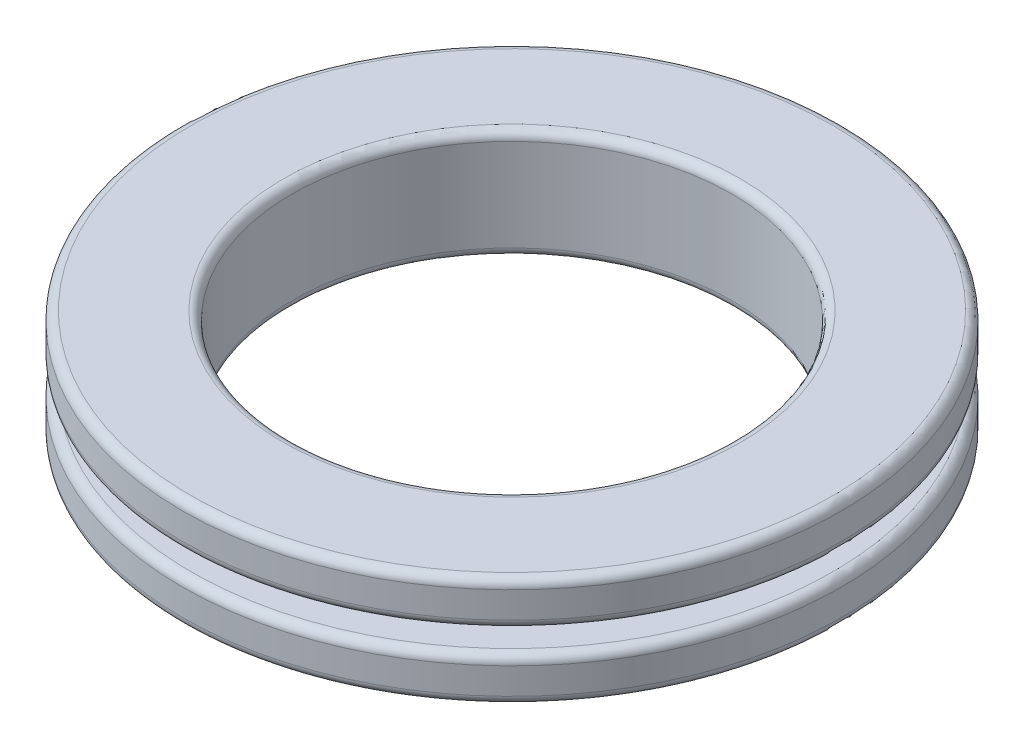
ISO-10303-21;
HEADER;
FILE_DESCRIPTION(('STEP AP214'),'2;1');
FILE_NAME('part.step','',(''),(''),'','','');
FILE_SCHEMA(('AUTOMOTIVE_DESIGN { 1 0 10303 214 1 1 1 1 }'));
ENDSEC;
DATA;
#1=APPLICATION_CONTEXT('core data for automotive mechanical design processes');
#2=APPLICATION_PROTOCOL_DEFINITION('international standard','automotive_design',2000,#1);
#3=PRODUCT_CONTEXT('',#1,'mechanical');
#4=PRODUCT('Part','Part','',(#3));
#5=PRODUCT_RELATED_PRODUCT_CATEGORY('part','',(#4));
#6=PRODUCT_DEFINITION_FORMATION('','',#4);
#7=PRODUCT_DEFINITION_CONTEXT('part definition',#1,'design');
#8=PRODUCT_DEFINITION('design','',#6,#7);
#9=PRODUCT_DEFINITION_SHAPE('','',#8);
#10=(LENGTH_UNIT() NAMED_UNIT(*) SI_UNIT(.MILLI.,.METRE.));
#11=(NAMED_UNIT(*) PLANE_ANGLE_UNIT() SI_UNIT($,.RADIAN.));
#12=(NAMED_UNIT(*) SI_UNIT($,.STERADIAN.) SOLID_ANGLE_UNIT());
#13=UNCERTAINTY_MEASURE_WITH_UNIT(LENGTH_MEASURE(1.E-05),#10,'distance_accuracy_value','');
#14=(GEOMETRIC_REPRESENTATION_CONTEXT(3) GLOBAL_UNCERTAINTY_ASSIGNED_CONTEXT((#13)) GLOBAL_UNIT_ASSIGNED_CONTEXT((#10,
#11,#12)) REPRESENTATION_CONTEXT('',''));
#15=CARTESIAN_POINT('',(0.,0.,0.));
#16=DIRECTION('',(0.,0.,1.));
#17=DIRECTION('',(1.,0.,0.));
#18=AXIS2_PLACEMENT_3D('',#15,#16,#17);
#19=CARTESIAN_POINT('',(0.,9.2,0.));
#20=DIRECTION('',(0.,-1.,0.));
#21=DIRECTION('',(0.,0.,-1.));
#22=AXIS2_PLACEMENT_3D('',#19,#20,#21);
#23=TOROIDAL_SURFACE('',#22,20.8,0.799999999999999);
#24=CARTESIAN_POINT('',(0.,9.19999999999999,0.));
#25=DIRECTION('',(0.,-1.,0.));
#26=DIRECTION('',(0.,0.,-1.));
#27=AXIS2_PLACEMENT_3D('',#24,#25,#26);
#28=CIRCLE('',#27,20.);
#29=CARTESIAN_POINT('',(0.,9.19999999999999,-20.));
#30=VERTEX_POINT('',#29);
#31=EDGE_CURVE('E83',#30,#30,#28,.T.);
#32=ORIENTED_EDGE('',*,*,#31,.T.);
#33=EDGE_LOOP('',(#32));
#34=FACE_BOUND('',#33,.T.);
#35=CARTESIAN_POINT('',(0.,10.,0.));
#36=DIRECTION('',(0.,-1.,0.));
#37=DIRECTION('',(0.,0.,-1.));
#38=AXIS2_PLACEMENT_3D('',#35,#36,#37);
#39=CIRCLE('',#38,20.8);
#40=CARTESIAN_POINT('',(0.,10.,-20.8));
#41=VERTEX_POINT('',#40);
#42=EDGE_CURVE('E10',#41,#41,#39,.T.);
#43=ORIENTED_EDGE('',*,*,#42,.F.);
#44=EDGE_LOOP('',(#43));
#45=FACE_BOUND('',#44,.T.);
#46=ADVANCED_FACE('F31',(#34,#45),#23,.T.);
#47=CARTESIAN_POINT('',(29.2,10.,0.));
#48=DIRECTION('',(0.,1.,0.));
#49=DIRECTION('',(0.,0.,1.));
#50=AXIS2_PLACEMENT_3D('',#47,#48,#49);
#51=PLANE('',#50);
#52=ORIENTED_EDGE('',*,*,#42,.T.);
#53=EDGE_LOOP('',(#52));
#54=FACE_BOUND('',#53,.T.);
#55=CARTESIAN_POINT('',(0.,10.,0.));
#56=DIRECTION('',(0.,-1.,0.));
#57=DIRECTION('',(0.,0.,-1.));
#58=AXIS2_PLACEMENT_3D('',#55,#56,#57);
#59=CIRCLE('',#58,29.2);
#60=CARTESIAN_POINT('',(0.,10.,-29.2));
#61=VERTEX_POINT('',#60);
#62=EDGE_CURVE('E37',#61,#61,#59,.T.);
#63=ORIENTED_EDGE('',*,*,#62,.F.);
#64=EDGE_LOOP('',(#63));
#65=FACE_BOUND('',#64,.T.);
#66=ADVANCED_FACE('F101',(#54,#65),#51,.T.);
#67=CARTESIAN_POINT('',(0.,9.2,0.));
#68=DIRECTION('',(0.,-1.,0.));
#69=DIRECTION('',(0.,0.,-1.));
#70=AXIS2_PLACEMENT_3D('',#67,#68,#69);
#71=TOROIDAL_SURFACE('',#70,29.2,0.799999999999999);
#72=ORIENTED_EDGE('',*,*,#62,.T.);
#73=EDGE_LOOP('',(#72));
#74=FACE_BOUND('',#73,.T.);
#75=CARTESIAN_POINT('',(0.,9.2,0.));
#76=DIRECTION('',(0.,-1.,0.));
#77=DIRECTION('',(0.,0.,-1.));
#78=AXIS2_PLACEMENT_3D('',#75,#76,#77);
#79=CIRCLE('',#78,30.);
#80=CARTESIAN_POINT('',(0.,9.2,-30.));
#81=VERTEX_POINT('',#80);
#82=EDGE_CURVE('E41',#81,#81,#79,.T.);
#83=ORIENTED_EDGE('',*,*,#82,.F.);
#84=EDGE_LOOP('',(#83));
#85=FACE_BOUND('',#84,.T.);
#86=ADVANCED_FACE('F105',(#74,#85),#71,.T.);
#87=CARTESIAN_POINT('',(0.,0.,0.));
#88=DIRECTION('',(0.,-1.,0.));
#89=DIRECTION('',(0.,0.,-1.));
#90=AXIS2_PLACEMENT_3D('',#87,#88,#89);
#91=CYLINDRICAL_SURFACE('',#90,30.);
#92=ORIENTED_EDGE('',*,*,#82,.T.);
#93=EDGE_LOOP('',(#92));
#94=FACE_BOUND('',#93,.T.);
#95=CARTESIAN_POINT('',(0.,6.80000000000001,0.));
#96=DIRECTION('',(0.,-1.,0.));
#97=DIRECTION('',(0.,0.,-1.));
#98=AXIS2_PLACEMENT_3D('',#95,#96,#97);
#99=CIRCLE('',#98,30.);
#100=CARTESIAN_POINT('',(0.,6.80000000000001,-30.));
#101=VERTEX_POINT('',#100);
#102=EDGE_CURVE('E45',#101,#101,#99,.T.);
#103=ORIENTED_EDGE('',*,*,#102,.F.);
#104=EDGE_LOOP('',(#103));
#105=FACE_BOUND('',#104,.T.);
#106=ADVANCED_FACE('F109',(#94,#105),#91,.T.);
#107=CARTESIAN_POINT('',(0.,6.8,0.));
#108=DIRECTION('',(0.,-1.,0.));
#109=DIRECTION('',(0.,0.,-1.));
#110=AXIS2_PLACEMENT_3D('',#107,#108,#109);
#111=TOROIDAL_SURFACE('',#110,29.2,0.799999999999999);
#112=ORIENTED_EDGE('',*,*,#102,.T.);
#113=EDGE_LOOP('',(#112));
#114=FACE_BOUND('',#113,.T.);
#115=CARTESIAN_POINT('',(0.,6.,0.));
#116=DIRECTION('',(0.,-1.,0.));
#117=DIRECTION('',(0.,0.,-1.));
#118=AXIS2_PLACEMENT_3D('',#115,#116,#117);
#119=CIRCLE('',#118,29.2);
#120=CARTESIAN_POINT('',(0.,6.,-29.2));
#121=VERTEX_POINT('',#120);
#122=EDGE_CURVE('E50',#121,#121,#119,.T.);
#123=ORIENTED_EDGE('',*,*,#122,.F.);
#124=EDGE_LOOP('',(#123));
#125=FACE_BOUND('',#124,.T.);
#126=ADVANCED_FACE('F115',(#114,#125),#111,.T.);
#127=CARTESIAN_POINT('',(25.8,6.,0.));
#128=DIRECTION('',(0.,-1.,0.));
#129=DIRECTION('',(0.,0.,-1.));
#130=AXIS2_PLACEMENT_3D('',#127,#128,#129);
#131=PLANE('',#130);
#132=ORIENTED_EDGE('',*,*,#122,.T.);
#133=EDGE_LOOP('',(#132));
#134=FACE_BOUND('',#133,.T.);
#135=CARTESIAN_POINT('',(0.,6.,0.));
#136=DIRECTION('',(0.,-1.,0.));
#137=DIRECTION('',(0.,0.,-1.));
#138=AXIS2_PLACEMENT_3D('',#135,#136,#137);
#139=CIRCLE('',#138,25.8);
#140=CARTESIAN_POINT('',(0.,6.,-25.8));
#141=VERTEX_POINT('',#140);
#142=EDGE_CURVE('E53',#141,#141,#139,.T.);
#143=ORIENTED_EDGE('',*,*,#142,.F.);
#144=EDGE_LOOP('',(#143));
#145=FACE_BOUND('',#144,.T.);
#146=ADVANCED_FACE('F119',(#134,#145),#131,.T.);
#147=CARTESIAN_POINT('',(0.,5.2,0.));
#148=DIRECTION('',(0.,-1.,0.));
#149=DIRECTION('',(0.,0.,-1.));
#150=AXIS2_PLACEMENT_3D('',#147,#148,#149);
#151=TOROIDAL_SURFACE('',#150,25.8,0.799999999999999);
#152=ORIENTED_EDGE('',*,*,#142,.T.);
#153=EDGE_LOOP('',(#152));
#154=FACE_BOUND('',#153,.T.);
#155=CARTESIAN_POINT('',(0.,5.19999999999999,0.));
#156=DIRECTION('',(0.,-1.,0.));
#157=DIRECTION('',(0.,0.,-1.));
#158=AXIS2_PLACEMENT_3D('',#155,#156,#157);
#159=CIRCLE('',#158,25.);
#160=CARTESIAN_POINT('',(0.,5.19999999999999,-25.));
#161=VERTEX_POINT('',#160);
#162=EDGE_CURVE('E56',#161,#161,#159,.T.);
#163=ORIENTED_EDGE('',*,*,#162,.F.);
#164=EDGE_LOOP('',(#163));
#165=FACE_BOUND('',#164,.T.);
#166=ADVANCED_FACE('F123',(#154,#165),#151,.F.);
#167=CARTESIAN_POINT('',(0.,0.,0.));
#168=DIRECTION('',(0.,-1.,0.));
#169=DIRECTION('',(0.,0.,-1.));
#170=AXIS2_PLACEMENT_3D('',#167,#168,#169);
#171=CYLINDRICAL_SURFACE('',#170,25.);
#172=ORIENTED_EDGE('',*,*,#162,.T.);
#173=EDGE_LOOP('',(#172));
#174=FACE_BOUND('',#173,.T.);
#175=CARTESIAN_POINT('',(0.,4.80000000000001,0.));
#176=DIRECTION('',(0.,-1.,0.));
#177=DIRECTION('',(0.,0.,-1.));
#178=AXIS2_PLACEMENT_3D('',#175,#176,#177);
#179=CIRCLE('',#178,25.);
#180=CARTESIAN_POINT('',(0.,4.80000000000001,-25.));
#181=VERTEX_POINT('',#180);
#182=EDGE_CURVE('E59',#181,#181,#179,.T.);
#183=ORIENTED_EDGE('',*,*,#182,.F.);
#184=EDGE_LOOP('',(#183));
#185=FACE_BOUND('',#184,.T.);
#186=ADVANCED_FACE('F127',(#174,#185),#171,.T.);
#187=CARTESIAN_POINT('',(0.,4.8,0.));
#188=DIRECTION('',(0.,-1.,0.));
#189=DIRECTION('',(0.,0.,-1.));
#190=AXIS2_PLACEMENT_3D('',#187,#188,#189);
#191=TOROIDAL_SURFACE('',#190,25.8,0.799999999999999);
#192=ORIENTED_EDGE('',*,*,#182,.T.);
#193=EDGE_LOOP('',(#192));
#194=FACE_BOUND('',#193,.T.);
#195=CARTESIAN_POINT('',(0.,4.,0.));
#196=DIRECTION('',(0.,-1.,0.));
#197=DIRECTION('',(0.,0.,-1.));
#198=AXIS2_PLACEMENT_3D('',#195,#196,#197);
#199=CIRCLE('',#198,25.8);
#200=CARTESIAN_POINT('',(0.,4.,-25.8));
#201=VERTEX_POINT('',#200);
#202=EDGE_CURVE('E62',#201,#201,#199,.T.);
#203=ORIENTED_EDGE('',*,*,#202,.F.);
#204=EDGE_LOOP('',(#203));
#205=FACE_BOUND('',#204,.T.);
#206=ADVANCED_FACE('F131',(#194,#205),#191,.F.);
#207=CARTESIAN_POINT('',(29.2,4.,0.));
#208=DIRECTION('',(0.,1.,0.));
#209=DIRECTION('',(0.,0.,1.));
#210=AXIS2_PLACEMENT_3D('',#207,#208,#209);
#211=PLANE('',#210);
#212=ORIENTED_EDGE('',*,*,#202,.T.);
#213=EDGE_LOOP('',(#212));
#214=FACE_BOUND('',#213,.T.);
#215=CARTESIAN_POINT('',(0.,4.,0.));
#216=DIRECTION('',(0.,-1.,0.));
#217=DIRECTION('',(0.,0.,-1.));
#218=AXIS2_PLACEMENT_3D('',#215,#216,#217);
#219=CIRCLE('',#218,29.2);
#220=CARTESIAN_POINT('',(0.,4.,-29.2));
#221=VERTEX_POINT('',#220);
#222=EDGE_CURVE('E65',#221,#221,#219,.T.);
#223=ORIENTED_EDGE('',*,*,#222,.F.);
#224=EDGE_LOOP('',(#223));
#225=FACE_BOUND('',#224,.T.);
#226=ADVANCED_FACE('F135',(#214,#225),#211,.T.);
#227=CARTESIAN_POINT('',(0.,3.2,0.));
#228=DIRECTION('',(0.,-1.,0.));
#229=DIRECTION('',(0.,0.,-1.));
#230=AXIS2_PLACEMENT_3D('',#227,#228,#229);
#231=TOROIDAL_SURFACE('',#230,29.2,0.799999999999999);
#232=ORIENTED_EDGE('',*,*,#222,.T.);
#233=EDGE_LOOP('',(#232));
#234=FACE_BOUND('',#233,.T.);
#235=CARTESIAN_POINT('',(0.,3.19999999999999,0.));
#236=DIRECTION('',(0.,-1.,0.));
#237=DIRECTION('',(0.,0.,-1.));
#238=AXIS2_PLACEMENT_3D('',#235,#236,#237);
#239=CIRCLE('',#238,30.);
#240=CARTESIAN_POINT('',(0.,3.19999999999999,-30.));
#241=VERTEX_POINT('',#240);
#242=EDGE_CURVE('E68',#241,#241,#239,.T.);
#243=ORIENTED_EDGE('',*,*,#242,.F.);
#244=EDGE_LOOP('',(#243));
#245=FACE_BOUND('',#244,.T.);
#246=ADVANCED_FACE('F139',(#234,#245),#231,.T.);
#247=CARTESIAN_POINT('',(0.,0.,0.));
#248=DIRECTION('',(0.,-1.,0.));
#249=DIRECTION('',(0.,0.,-1.));
#250=AXIS2_PLACEMENT_3D('',#247,#248,#249);
#251=CYLINDRICAL_SURFACE('',#250,30.);
#252=ORIENTED_EDGE('',*,*,#242,.T.);
#253=EDGE_LOOP('',(#252));
#254=FACE_BOUND('',#253,.T.);
#255=CARTESIAN_POINT('',(0.,0.800000000000006,0.));
#256=DIRECTION('',(0.,-1.,0.));
#257=DIRECTION('',(0.,0.,-1.));
#258=AXIS2_PLACEMENT_3D('',#255,#256,#257);
#259=CIRCLE('',#258,30.);
#260=CARTESIAN_POINT('',(0.,0.800000000000006,-30.));
#261=VERTEX_POINT('',#260);
#262=EDGE_CURVE('E71',#261,#261,#259,.T.);
#263=ORIENTED_EDGE('',*,*,#262,.F.);
#264=EDGE_LOOP('',(#263));
#265=FACE_BOUND('',#264,.T.);
#266=ADVANCED_FACE('F143',(#254,#265),#251,.T.);
#267=CARTESIAN_POINT('',(0.,0.8,0.));
#268=DIRECTION('',(0.,-1.,0.));
#269=DIRECTION('',(0.,0.,-1.));
#270=AXIS2_PLACEMENT_3D('',#267,#268,#269);
#271=TOROIDAL_SURFACE('',#270,29.2,0.799999999999999);
#272=ORIENTED_EDGE('',*,*,#262,.T.);
#273=EDGE_LOOP('',(#272));
#274=FACE_BOUND('',#273,.T.);
#275=CARTESIAN_POINT('',(0.,0.,0.));
#276=DIRECTION('',(0.,-1.,0.));
#277=DIRECTION('',(0.,0.,-1.));
#278=AXIS2_PLACEMENT_3D('',#275,#276,#277);
#279=CIRCLE('',#278,29.2);
#280=CARTESIAN_POINT('',(0.,0.,-29.2));
#281=VERTEX_POINT('',#280);
#282=EDGE_CURVE('E74',#281,#281,#279,.T.);
#283=ORIENTED_EDGE('',*,*,#282,.F.);
#284=EDGE_LOOP('',(#283));
#285=FACE_BOUND('',#284,.T.);
#286=ADVANCED_FACE('F147',(#274,#285),#271,.T.);
#287=CARTESIAN_POINT('',(20.8,0.,0.));
#288=DIRECTION('',(0.,-1.,0.));
#289=DIRECTION('',(0.,0.,-1.));
#290=AXIS2_PLACEMENT_3D('',#287,#288,#289);
#291=PLANE('',#290);
#292=ORIENTED_EDGE('',*,*,#282,.T.);
#293=EDGE_LOOP('',(#292));
#294=FACE_BOUND('',#293,.T.);
#295=CARTESIAN_POINT('',(0.,0.,0.));
#296=DIRECTION('',(0.,-1.,0.));
#297=DIRECTION('',(0.,0.,-1.));
#298=AXIS2_PLACEMENT_3D('',#295,#296,#297);
#299=CIRCLE('',#298,20.8);
#300=CARTESIAN_POINT('',(0.,0.,-20.8));
#301=VERTEX_POINT('',#300);
#302=EDGE_CURVE('E77',#301,#301,#299,.T.);
#303=ORIENTED_EDGE('',*,*,#302,.F.);
#304=EDGE_LOOP('',(#303));
#305=FACE_BOUND('',#304,.T.);
#306=ADVANCED_FACE('F97',(#294,#305),#291,.T.);
#307=CARTESIAN_POINT('',(0.,0.8,0.));
#308=DIRECTION('',(0.,-1.,0.));
#309=DIRECTION('',(0.,0.,-1.));
#310=AXIS2_PLACEMENT_3D('',#307,#308,#309);
#311=TOROIDAL_SURFACE('',#310,20.8,0.799999999999999);
#312=ORIENTED_EDGE('',*,*,#302,.T.);
#313=EDGE_LOOP('',(#312));
#314=FACE_BOUND('',#313,.T.);
#315=CARTESIAN_POINT('',(0.,0.800000000000006,0.));
#316=DIRECTION('',(0.,-1.,0.));
#317=DIRECTION('',(0.,0.,-1.));
#318=AXIS2_PLACEMENT_3D('',#315,#316,#317);
#319=CIRCLE('',#318,20.);
#320=CARTESIAN_POINT('',(0.,0.800000000000006,-20.));
#321=VERTEX_POINT('',#320);
#322=EDGE_CURVE('E80',#321,#321,#319,.T.);
#323=ORIENTED_EDGE('',*,*,#322,.F.);
#324=EDGE_LOOP('',(#323));
#325=FACE_BOUND('',#324,.T.);
#326=ADVANCED_FACE('F91',(#314,#325),#311,.T.);
#327=CARTESIAN_POINT('',(0.,0.,0.));
#328=DIRECTION('',(0.,-1.,0.));
#329=DIRECTION('',(0.,0.,-1.));
#330=AXIS2_PLACEMENT_3D('',#327,#328,#329);
#331=CYLINDRICAL_SURFACE('',#330,20.);
#332=ORIENTED_EDGE('',*,*,#322,.T.);
#333=EDGE_LOOP('',(#332));
#334=FACE_BOUND('',#333,.T.);
#335=ORIENTED_EDGE('',*,*,#31,.F.);
#336=EDGE_LOOP('',(#335));
#337=FACE_BOUND('',#336,.T.);
#338=ADVANCED_FACE('F89',(#334,#337),#331,.F.);
#339=CLOSED_SHELL('',(#46,#66,#86,#106,#126,#146,#166,#186,#206,#226,#246,#266,#286,#306,#326,#338));
#340=MANIFOLD_SOLID_BREP('B2',#339);
#341=ADVANCED_BREP_SHAPE_REPRESENTATION('',(#18,#340),#14);
#342=SHAPE_DEFINITION_REPRESENTATION(#9,#341);
ENDSEC;
END-ISO-10303-21;
